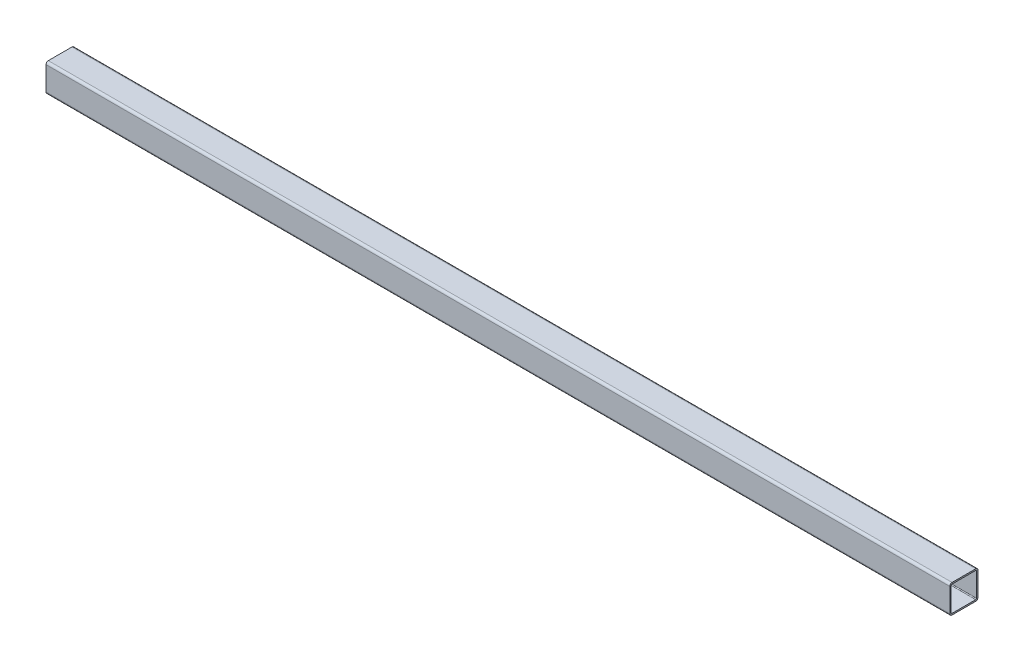
ISO-10303-21;
HEADER;
FILE_DESCRIPTION(('STEP AP214'),'2;1');
FILE_NAME('part.step','',(''),(''),'','','');
FILE_SCHEMA(('AUTOMOTIVE_DESIGN { 1 0 10303 214 1 1 1 1 }'));
ENDSEC;
DATA;
#1=APPLICATION_CONTEXT('core data for automotive mechanical design processes');
#2=APPLICATION_PROTOCOL_DEFINITION('international standard','automotive_design',2000,#1);
#3=PRODUCT_CONTEXT('',#1,'mechanical');
#4=PRODUCT('Part','Part','',(#3));
#5=PRODUCT_RELATED_PRODUCT_CATEGORY('part','',(#4));
#6=PRODUCT_DEFINITION_FORMATION('','',#4);
#7=PRODUCT_DEFINITION_CONTEXT('part definition',#1,'design');
#8=PRODUCT_DEFINITION('design','',#6,#7);
#9=PRODUCT_DEFINITION_SHAPE('','',#8);
#10=(LENGTH_UNIT() NAMED_UNIT(*) SI_UNIT(.MILLI.,.METRE.));
#11=(NAMED_UNIT(*) PLANE_ANGLE_UNIT() SI_UNIT($,.RADIAN.));
#12=(NAMED_UNIT(*) SI_UNIT($,.STERADIAN.) SOLID_ANGLE_UNIT());
#13=UNCERTAINTY_MEASURE_WITH_UNIT(LENGTH_MEASURE(1.E-05),#10,'distance_accuracy_value','');
#14=(GEOMETRIC_REPRESENTATION_CONTEXT(3) GLOBAL_UNCERTAINTY_ASSIGNED_CONTEXT((#13)) GLOBAL_UNIT_ASSIGNED_CONTEXT((#10,
#11,#12)) REPRESENTATION_CONTEXT('',''));
#15=CARTESIAN_POINT('',(0.,0.,0.));
#16=DIRECTION('',(0.,0.,1.));
#17=DIRECTION('',(1.,0.,0.));
#18=AXIS2_PLACEMENT_3D('',#15,#16,#17);
#19=CARTESIAN_POINT('',(609.6,7.90033438413667,24.0360225974819));
#20=DIRECTION('',(1.,0.,0.));
#21=DIRECTION('',(0.,0.,-1.));
#22=AXIS2_PLACEMENT_3D('',#19,#20,#21);
#23=PLANE('',#22);
#24=CARTESIAN_POINT('',(609.6,7.90033438413668,24.0360225974819));
#25=DIRECTION('',(1.,0.,0.));
#26=DIRECTION('',(0.,0.,-1.));
#27=AXIS2_PLACEMENT_3D('',#24,#25,#26);
#28=CIRCLE('',#27,1.55033438425608);
#29=CARTESIAN_POINT('',(609.6,7.90033438413667,25.5863569817379));
#30=VERTEX_POINT('',#29);
#31=CARTESIAN_POINT('',(609.6,6.3499999998806,24.0360225974819));
#32=VERTEX_POINT('',#31);
#33=EDGE_CURVE('E269',#30,#32,#28,.T.);
#34=ORIENTED_EDGE('',*,*,#33,.T.);
#35=DIRECTION('',(0.,0.,-1.));
#36=VECTOR('',#35,1.);
#37=CARTESIAN_POINT('',(609.6,6.3499999998806,24.0360225974819));
#38=LINE('',#37,#36);
#39=CARTESIAN_POINT('',(609.6,6.3499999998806,8.08669136599401));
#40=VERTEX_POINT('',#39);
#41=EDGE_CURVE('E494',#32,#40,#38,.T.);
#42=ORIENTED_EDGE('',*,*,#41,.T.);
#43=CARTESIAN_POINT('',(609.6,7.90033438413667,8.08669136599401));
#44=DIRECTION('',(1.,0.,0.));
#45=DIRECTION('',(0.,0.,-1.));
#46=AXIS2_PLACEMENT_3D('',#43,#44,#45);
#47=CIRCLE('',#46,1.55033438425607);
#48=CARTESIAN_POINT('',(609.6,7.90033438413667,6.53635698173793));
#49=VERTEX_POINT('',#48);
#50=EDGE_CURVE('E170',#40,#49,#47,.T.);
#51=ORIENTED_EDGE('',*,*,#50,.T.);
#52=DIRECTION('',(0.,1.,0.));
#53=VECTOR('',#52,1.);
#54=CARTESIAN_POINT('',(609.6,7.90033438413667,6.53635698173793));
#55=LINE('',#54,#53);
#56=CARTESIAN_POINT('',(609.6,23.8496656156245,6.53635698173793));
#57=VERTEX_POINT('',#56);
#58=EDGE_CURVE('E481',#49,#57,#55,.T.);
#59=ORIENTED_EDGE('',*,*,#58,.T.);
#60=CARTESIAN_POINT('',(609.6,23.8496656156245,8.08669136599401));
#61=DIRECTION('',(1.,0.,0.));
#62=DIRECTION('',(0.,0.,-1.));
#63=AXIS2_PLACEMENT_3D('',#60,#61,#62);
#64=CIRCLE('',#63,1.55033438425607);
#65=CARTESIAN_POINT('',(609.6,25.3999999998806,8.08669136599401));
#66=VERTEX_POINT('',#65);
#67=EDGE_CURVE('E490',#57,#66,#64,.T.);
#68=ORIENTED_EDGE('',*,*,#67,.T.);
#69=DIRECTION('',(0.,0.,1.));
#70=VECTOR('',#69,1.);
#71=CARTESIAN_POINT('',(609.6,25.3999999998806,8.08669136599401));
#72=LINE('',#71,#70);
#73=CARTESIAN_POINT('',(609.6,25.3999999998806,24.0360225974819));
#74=VERTEX_POINT('',#73);
#75=EDGE_CURVE('E285',#66,#74,#72,.T.);
#76=ORIENTED_EDGE('',*,*,#75,.T.);
#77=CARTESIAN_POINT('',(609.6,23.8496656156245,24.0360225974819));
#78=DIRECTION('',(1.,0.,0.));
#79=DIRECTION('',(0.,0.,-1.));
#80=AXIS2_PLACEMENT_3D('',#77,#78,#79);
#81=CIRCLE('',#80,1.55033438425608);
#82=CARTESIAN_POINT('',(609.6,23.8496656156245,25.5863569817379));
#83=VERTEX_POINT('',#82);
#84=EDGE_CURVE('E302',#74,#83,#81,.T.);
#85=ORIENTED_EDGE('',*,*,#84,.T.);
#86=DIRECTION('',(0.,-1.,0.));
#87=VECTOR('',#86,1.);
#88=CARTESIAN_POINT('',(609.6,23.8496656156245,25.5863569817379));
#89=LINE('',#88,#87);
#90=EDGE_CURVE('E266',#83,#30,#89,.T.);
#91=ORIENTED_EDGE('',*,*,#90,.T.);
#92=EDGE_LOOP('',(#34,#42,#51,#59,#68,#76,#85,#91));
#93=FACE_BOUND('',#92,.T.);
#94=DIRECTION('',(0.,1.,0.));
#95=VECTOR('',#94,1.);
#96=CARTESIAN_POINT('',(609.6,7.87399999987999,7.52695698173792));
#97=LINE('',#96,#95);
#98=CARTESIAN_POINT('',(609.6,7.87399999987999,7.52695698173792));
#99=VERTEX_POINT('',#98);
#100=CARTESIAN_POINT('',(609.6,23.8750732117556,7.52695698173792));
#101=VERTEX_POINT('',#100);
#102=EDGE_CURVE('E262',#99,#101,#97,.T.);
#103=ORIENTED_EDGE('',*,*,#102,.F.);
#104=CARTESIAN_POINT('',(609.6,7.87399919472792,8.06035698173732));
#105=DIRECTION('',(1.,0.,0.));
#106=DIRECTION('',(0.,0.,-1.));
#107=AXIS2_PLACEMENT_3D('',#104,#105,#106);
#108=CIRCLE('',#107,0.533400000000004);
#109=CARTESIAN_POINT('',(609.6,7.34059999988059,8.06128376986236));
#110=VERTEX_POINT('',#109);
#111=EDGE_CURVE('E109',#110,#99,#108,.T.);
#112=ORIENTED_EDGE('',*,*,#111,.F.);
#113=DIRECTION('',(0.,0.,-1.));
#114=VECTOR('',#113,1.);
#115=CARTESIAN_POINT('',(609.6,7.3405999998806,24.0623569817379));
#116=LINE('',#115,#114);
#117=CARTESIAN_POINT('',(609.6,7.3405999998806,24.0623569817379));
#118=VERTEX_POINT('',#117);
#119=EDGE_CURVE('E221',#118,#110,#116,.T.);
#120=ORIENTED_EDGE('',*,*,#119,.F.);
#121=CARTESIAN_POINT('',(609.6,7.87399999987999,24.0623577868906));
#122=DIRECTION('',(1.,0.,0.));
#123=DIRECTION('',(0.,0.,-1.));
#124=AXIS2_PLACEMENT_3D('',#121,#122,#123);
#125=CIRCLE('',#124,0.533400000000005);
#126=CARTESIAN_POINT('',(609.6,7.87492678800502,24.5957569817379));
#127=VERTEX_POINT('',#126);
#128=EDGE_CURVE('E252',#127,#118,#125,.T.);
#129=ORIENTED_EDGE('',*,*,#128,.F.);
#130=DIRECTION('',(0.,-1.,0.));
#131=VECTOR('',#130,1.);
#132=CARTESIAN_POINT('',(609.6,23.8759999998806,24.5957569817379));
#133=LINE('',#132,#131);
#134=CARTESIAN_POINT('',(609.6,23.8759999998806,24.5957569817379));
#135=VERTEX_POINT('',#134);
#136=EDGE_CURVE('E238',#135,#127,#133,.T.);
#137=ORIENTED_EDGE('',*,*,#136,.F.);
#138=CARTESIAN_POINT('',(609.6,23.8759999998806,24.0623569817379));
#139=DIRECTION('',(1.,0.,0.));
#140=DIRECTION('',(0.,0.,-1.));
#141=AXIS2_PLACEMENT_3D('',#138,#139,#140);
#142=CIRCLE('',#141,0.533400000000007);
#143=CARTESIAN_POINT('',(609.6,24.4093999998806,24.0623569817379));
#144=VERTEX_POINT('',#143);
#145=EDGE_CURVE('E247',#144,#135,#142,.T.);
#146=ORIENTED_EDGE('',*,*,#145,.F.);
#147=DIRECTION('',(0.,0.,1.));
#148=VECTOR('',#147,1.);
#149=CARTESIAN_POINT('',(609.6,24.4093999998806,8.06128376986236));
#150=LINE('',#149,#148);
#151=CARTESIAN_POINT('',(609.6,24.4093999998806,8.06128376986236));
#152=VERTEX_POINT('',#151);
#153=EDGE_CURVE('E255',#152,#144,#150,.T.);
#154=ORIENTED_EDGE('',*,*,#153,.F.);
#155=CARTESIAN_POINT('',(609.6,23.8760008064353,8.06035617518324));
#156=DIRECTION('',(1.,3.53726020742631E-13,-3.53726020743027E-13));
#157=DIRECTION('',(-3.53726020743027E-13,0.,-1.));
#158=AXIS2_PLACEMENT_3D('',#155,#156,#157);
#159=CIRCLE('',#158,0.533400000000002);
#160=EDGE_CURVE('E260',#101,#152,#159,.T.);
#161=ORIENTED_EDGE('',*,*,#160,.F.);
#162=EDGE_LOOP('',(#103,#112,#120,#129,#137,#146,#154,#161));
#163=FACE_BOUND('',#162,.T.);
#164=ADVANCED_FACE('F50',(#93,#163),#23,.T.);
#165=CARTESIAN_POINT('',(0.,7.90033438413667,24.0360225974819));
#166=DIRECTION('',(1.,0.,0.));
#167=DIRECTION('',(0.,0.,-1.));
#168=AXIS2_PLACEMENT_3D('',#165,#166,#167);
#169=PLANE('',#168);
#170=CARTESIAN_POINT('',(0.,7.90033438413668,24.0360225974819));
#171=DIRECTION('',(1.,0.,0.));
#172=DIRECTION('',(0.,0.,-1.));
#173=AXIS2_PLACEMENT_3D('',#170,#171,#172);
#174=CIRCLE('',#173,1.55033438425608);
#175=CARTESIAN_POINT('',(0.,7.90033438413667,25.5863569817379));
#176=VERTEX_POINT('',#175);
#177=CARTESIAN_POINT('',(0.,6.3499999998806,24.0360225974819));
#178=VERTEX_POINT('',#177);
#179=EDGE_CURVE('E163',#176,#178,#174,.T.);
#180=ORIENTED_EDGE('',*,*,#179,.F.);
#181=DIRECTION('',(0.,-1.,0.));
#182=VECTOR('',#181,1.);
#183=CARTESIAN_POINT('',(0.,23.8496656156245,25.5863569817379));
#184=LINE('',#183,#182);
#185=CARTESIAN_POINT('',(0.,23.8496656156245,25.5863569817379));
#186=VERTEX_POINT('',#185);
#187=EDGE_CURVE('E267',#186,#176,#184,.T.);
#188=ORIENTED_EDGE('',*,*,#187,.F.);
#189=CARTESIAN_POINT('',(0.,23.8496656156245,24.0360225974819));
#190=DIRECTION('',(1.,0.,0.));
#191=DIRECTION('',(0.,0.,-1.));
#192=AXIS2_PLACEMENT_3D('',#189,#190,#191);
#193=CIRCLE('',#192,1.55033438425608);
#194=CARTESIAN_POINT('',(0.,25.3999999998806,24.0360225974819));
#195=VERTEX_POINT('',#194);
#196=EDGE_CURVE('E270',#195,#186,#193,.T.);
#197=ORIENTED_EDGE('',*,*,#196,.F.);
#198=DIRECTION('',(0.,0.,1.));
#199=VECTOR('',#198,1.);
#200=CARTESIAN_POINT('',(0.,25.3999999998806,8.08669136599401));
#201=LINE('',#200,#199);
#202=CARTESIAN_POINT('',(0.,25.3999999998806,8.08669136599401));
#203=VERTEX_POINT('',#202);
#204=EDGE_CURVE('E272',#203,#195,#201,.T.);
#205=ORIENTED_EDGE('',*,*,#204,.F.);
#206=CARTESIAN_POINT('',(0.,23.8496656156245,8.08669136599401));
#207=DIRECTION('',(1.,0.,0.));
#208=DIRECTION('',(0.,0.,-1.));
#209=AXIS2_PLACEMENT_3D('',#206,#207,#208);
#210=CIRCLE('',#209,1.55033438425607);
#211=CARTESIAN_POINT('',(0.,23.8496656156245,6.53635698173793));
#212=VERTEX_POINT('',#211);
#213=EDGE_CURVE('E179',#212,#203,#210,.T.);
#214=ORIENTED_EDGE('',*,*,#213,.F.);
#215=DIRECTION('',(0.,1.,0.));
#216=VECTOR('',#215,1.);
#217=CARTESIAN_POINT('',(0.,7.90033438413667,6.53635698173793));
#218=LINE('',#217,#216);
#219=CARTESIAN_POINT('',(0.,7.90033438413667,6.53635698173793));
#220=VERTEX_POINT('',#219);
#221=EDGE_CURVE('E177',#220,#212,#218,.T.);
#222=ORIENTED_EDGE('',*,*,#221,.F.);
#223=CARTESIAN_POINT('',(0.,7.90033438413667,8.08669136599401));
#224=DIRECTION('',(1.,0.,0.));
#225=DIRECTION('',(0.,0.,-1.));
#226=AXIS2_PLACEMENT_3D('',#223,#224,#225);
#227=CIRCLE('',#226,1.55033438425607);
#228=CARTESIAN_POINT('',(0.,6.3499999998806,8.08669136599401));
#229=VERTEX_POINT('',#228);
#230=EDGE_CURVE('E162',#229,#220,#227,.T.);
#231=ORIENTED_EDGE('',*,*,#230,.F.);
#232=DIRECTION('',(0.,0.,-1.));
#233=VECTOR('',#232,1.);
#234=CARTESIAN_POINT('',(0.,6.3499999998806,24.0360225974819));
#235=LINE('',#234,#233);
#236=EDGE_CURVE('E152',#178,#229,#235,.T.);
#237=ORIENTED_EDGE('',*,*,#236,.F.);
#238=EDGE_LOOP('',(#180,#188,#197,#205,#214,#222,#231,#237));
#239=FACE_BOUND('',#238,.T.);
#240=CARTESIAN_POINT('',(0.,7.87399919472792,8.06035698173732));
#241=DIRECTION('',(1.,0.,0.));
#242=DIRECTION('',(0.,0.,-1.));
#243=AXIS2_PLACEMENT_3D('',#240,#241,#242);
#244=CIRCLE('',#243,0.533400000000001);
#245=CARTESIAN_POINT('',(0.,7.34059999988059,8.06128376986236));
#246=VERTEX_POINT('',#245);
#247=CARTESIAN_POINT('',(0.,7.87399999987999,7.52695698173792));
#248=VERTEX_POINT('',#247);
#249=EDGE_CURVE('E75',#246,#248,#244,.T.);
#250=ORIENTED_EDGE('',*,*,#249,.T.);
#251=DIRECTION('',(0.,1.,0.));
#252=VECTOR('',#251,1.);
#253=CARTESIAN_POINT('',(0.,7.87399999987999,7.52695698173792));
#254=LINE('',#253,#252);
#255=CARTESIAN_POINT('',(0.,23.8750732117556,7.52695698173792));
#256=VERTEX_POINT('',#255);
#257=EDGE_CURVE('E184',#248,#256,#254,.T.);
#258=ORIENTED_EDGE('',*,*,#257,.T.);
#259=CARTESIAN_POINT('',(0.,23.8760008064353,8.06035617518324));
#260=DIRECTION('',(1.,0.,0.));
#261=DIRECTION('',(0.,0.,-1.));
#262=AXIS2_PLACEMENT_3D('',#259,#260,#261);
#263=CIRCLE('',#262,0.533400000000002);
#264=CARTESIAN_POINT('',(0.,24.4093999998806,8.06128376986236));
#265=VERTEX_POINT('',#264);
#266=EDGE_CURVE('E187',#256,#265,#263,.T.);
#267=ORIENTED_EDGE('',*,*,#266,.T.);
#268=DIRECTION('',(0.,0.,1.));
#269=VECTOR('',#268,1.);
#270=CARTESIAN_POINT('',(0.,24.4093999998806,8.06128376986236));
#271=LINE('',#270,#269);
#272=CARTESIAN_POINT('',(0.,24.4093999998806,24.0623569817379));
#273=VERTEX_POINT('',#272);
#274=EDGE_CURVE('E190',#265,#273,#271,.T.);
#275=ORIENTED_EDGE('',*,*,#274,.T.);
#276=CARTESIAN_POINT('',(0.,23.8759999998806,24.0623569817379));
#277=DIRECTION('',(1.,0.,0.));
#278=DIRECTION('',(0.,0.,-1.));
#279=AXIS2_PLACEMENT_3D('',#276,#277,#278);
#280=CIRCLE('',#279,0.533400000000007);
#281=CARTESIAN_POINT('',(0.,23.8759999998806,24.5957569817379));
#282=VERTEX_POINT('',#281);
#283=EDGE_CURVE('E193',#273,#282,#280,.T.);
#284=ORIENTED_EDGE('',*,*,#283,.T.);
#285=DIRECTION('',(0.,-1.,0.));
#286=VECTOR('',#285,1.);
#287=CARTESIAN_POINT('',(0.,23.8759999998806,24.5957569817379));
#288=LINE('',#287,#286);
#289=CARTESIAN_POINT('',(0.,7.87492678800502,24.5957569817379));
#290=VERTEX_POINT('',#289);
#291=EDGE_CURVE('E196',#282,#290,#288,.T.);
#292=ORIENTED_EDGE('',*,*,#291,.T.);
#293=CARTESIAN_POINT('',(0.,7.87399999987999,24.0623577868906));
#294=DIRECTION('',(1.,0.,0.));
#295=DIRECTION('',(0.,0.,-1.));
#296=AXIS2_PLACEMENT_3D('',#293,#294,#295);
#297=CIRCLE('',#296,0.533400000000005);
#298=CARTESIAN_POINT('',(0.,7.34059999988059,24.0623569817379));
#299=VERTEX_POINT('',#298);
#300=EDGE_CURVE('E199',#290,#299,#297,.T.);
#301=ORIENTED_EDGE('',*,*,#300,.T.);
#302=DIRECTION('',(0.,0.,-1.));
#303=VECTOR('',#302,1.);
#304=CARTESIAN_POINT('',(0.,7.3405999998806,24.0623569817379));
#305=LINE('',#304,#303);
#306=EDGE_CURVE('E202',#299,#246,#305,.T.);
#307=ORIENTED_EDGE('',*,*,#306,.T.);
#308=EDGE_LOOP('',(#250,#258,#267,#275,#284,#292,#301,#307));
#309=FACE_BOUND('',#308,.T.);
#310=ADVANCED_FACE('F174',(#239,#309),#169,.F.);
#311=CARTESIAN_POINT('',(609.6,7.90033438413667,24.0360225974819));
#312=DIRECTION('',(-1.,0.,0.));
#313=DIRECTION('',(0.,-1.,0.));
#314=AXIS2_PLACEMENT_3D('',#311,#312,#313);
#315=CYLINDRICAL_SURFACE('',#314,1.55033438425608);
#316=ORIENTED_EDGE('',*,*,#179,.T.);
#317=DIRECTION('',(-1.,0.,0.));
#318=VECTOR('',#317,1.);
#319=CARTESIAN_POINT('',(609.6,6.3499999998806,24.0360225974819));
#320=LINE('',#319,#318);
#321=EDGE_CURVE('E12',#32,#178,#320,.T.);
#322=ORIENTED_EDGE('',*,*,#321,.F.);
#323=ORIENTED_EDGE('',*,*,#33,.F.);
#324=DIRECTION('',(-1.,0.,0.));
#325=VECTOR('',#324,1.);
#326=CARTESIAN_POINT('',(609.6,7.90033438413667,25.5863569817379));
#327=LINE('',#326,#325);
#328=EDGE_CURVE('E218',#30,#176,#327,.T.);
#329=ORIENTED_EDGE('',*,*,#328,.T.);
#330=EDGE_LOOP('',(#316,#322,#323,#329));
#331=FACE_BOUND('',#330,.T.);
#332=ADVANCED_FACE('F332',(#331),#315,.T.);
#333=CARTESIAN_POINT('',(609.6,6.3499999998806,24.0360225974819));
#334=DIRECTION('',(0.,1.,0.));
#335=DIRECTION('',(0.,0.,1.));
#336=AXIS2_PLACEMENT_3D('',#333,#334,#335);
#337=PLANE('',#336);
#338=ORIENTED_EDGE('',*,*,#236,.T.);
#339=DIRECTION('',(-1.,0.,0.));
#340=VECTOR('',#339,1.);
#341=CARTESIAN_POINT('',(609.6,6.3499999998806,8.08669136599401));
#342=LINE('',#341,#340);
#343=EDGE_CURVE('E59',#40,#229,#342,.T.);
#344=ORIENTED_EDGE('',*,*,#343,.F.);
#345=ORIENTED_EDGE('',*,*,#41,.F.);
#346=ORIENTED_EDGE('',*,*,#321,.T.);
#347=EDGE_LOOP('',(#338,#344,#345,#346));
#348=FACE_BOUND('',#347,.T.);
#349=ADVANCED_FACE('F156',(#348),#337,.F.);
#350=CARTESIAN_POINT('',(609.6,7.90033438413667,8.08669136599401));
#351=DIRECTION('',(-1.,0.,0.));
#352=DIRECTION('',(0.,-1.,0.));
#353=AXIS2_PLACEMENT_3D('',#350,#351,#352);
#354=CYLINDRICAL_SURFACE('',#353,1.55033438425608);
#355=ORIENTED_EDGE('',*,*,#230,.T.);
#356=DIRECTION('',(-1.,0.,0.));
#357=VECTOR('',#356,1.);
#358=CARTESIAN_POINT('',(609.6,7.90033438413667,6.53635698173793));
#359=LINE('',#358,#357);
#360=EDGE_CURVE('E171',#49,#220,#359,.T.);
#361=ORIENTED_EDGE('',*,*,#360,.F.);
#362=ORIENTED_EDGE('',*,*,#50,.F.);
#363=ORIENTED_EDGE('',*,*,#343,.T.);
#364=EDGE_LOOP('',(#355,#361,#362,#363));
#365=FACE_BOUND('',#364,.T.);
#366=ADVANCED_FACE('F166',(#365),#354,.T.);
#367=CARTESIAN_POINT('',(609.6,7.90033438413667,6.53635698173793));
#368=DIRECTION('',(0.,0.,1.));
#369=DIRECTION('',(0.,-1.,0.));
#370=AXIS2_PLACEMENT_3D('',#367,#368,#369);
#371=PLANE('',#370);
#372=ORIENTED_EDGE('',*,*,#221,.T.);
#373=DIRECTION('',(-1.,0.,0.));
#374=VECTOR('',#373,1.);
#375=CARTESIAN_POINT('',(609.6,23.8496656156245,6.53635698173793));
#376=LINE('',#375,#374);
#377=EDGE_CURVE('E206',#57,#212,#376,.T.);
#378=ORIENTED_EDGE('',*,*,#377,.F.);
#379=ORIENTED_EDGE('',*,*,#58,.F.);
#380=ORIENTED_EDGE('',*,*,#360,.T.);
#381=EDGE_LOOP('',(#372,#378,#379,#380));
#382=FACE_BOUND('',#381,.T.);
#383=ADVANCED_FACE('F342',(#382),#371,.F.);
#384=CARTESIAN_POINT('',(609.6,23.8496656156245,8.08669136599401));
#385=DIRECTION('',(-1.,0.,0.));
#386=DIRECTION('',(0.,-1.,0.));
#387=AXIS2_PLACEMENT_3D('',#384,#385,#386);
#388=CYLINDRICAL_SURFACE('',#387,1.55033438425608);
#389=ORIENTED_EDGE('',*,*,#213,.T.);
#390=DIRECTION('',(-1.,0.,0.));
#391=VECTOR('',#390,1.);
#392=CARTESIAN_POINT('',(609.6,25.3999999998806,8.08669136599401));
#393=LINE('',#392,#391);
#394=EDGE_CURVE('E209',#66,#203,#393,.T.);
#395=ORIENTED_EDGE('',*,*,#394,.F.);
#396=ORIENTED_EDGE('',*,*,#67,.F.);
#397=ORIENTED_EDGE('',*,*,#377,.T.);
#398=EDGE_LOOP('',(#389,#395,#396,#397));
#399=FACE_BOUND('',#398,.T.);
#400=ADVANCED_FACE('F275',(#399),#388,.T.);
#401=CARTESIAN_POINT('',(609.6,25.3999999998806,8.08669136599401));
#402=DIRECTION('',(0.,-1.,0.));
#403=DIRECTION('',(0.,0.,-1.));
#404=AXIS2_PLACEMENT_3D('',#401,#402,#403);
#405=PLANE('',#404);
#406=ORIENTED_EDGE('',*,*,#204,.T.);
#407=DIRECTION('',(-1.,0.,0.));
#408=VECTOR('',#407,1.);
#409=CARTESIAN_POINT('',(609.6,25.3999999998806,24.0360225974819));
#410=LINE('',#409,#408);
#411=EDGE_CURVE('E212',#74,#195,#410,.T.);
#412=ORIENTED_EDGE('',*,*,#411,.F.);
#413=ORIENTED_EDGE('',*,*,#75,.F.);
#414=ORIENTED_EDGE('',*,*,#394,.T.);
#415=EDGE_LOOP('',(#406,#412,#413,#414));
#416=FACE_BOUND('',#415,.T.);
#417=ADVANCED_FACE('F282',(#416),#405,.F.);
#418=CARTESIAN_POINT('',(609.6,23.8496656156245,24.0360225974819));
#419=DIRECTION('',(-1.,0.,0.));
#420=DIRECTION('',(0.,-1.,0.));
#421=AXIS2_PLACEMENT_3D('',#418,#419,#420);
#422=CYLINDRICAL_SURFACE('',#421,1.55033438425608);
#423=ORIENTED_EDGE('',*,*,#196,.T.);
#424=DIRECTION('',(-1.,0.,0.));
#425=VECTOR('',#424,1.);
#426=CARTESIAN_POINT('',(609.6,23.8496656156245,25.5863569817379));
#427=LINE('',#426,#425);
#428=EDGE_CURVE('E215',#83,#186,#427,.T.);
#429=ORIENTED_EDGE('',*,*,#428,.F.);
#430=ORIENTED_EDGE('',*,*,#84,.F.);
#431=ORIENTED_EDGE('',*,*,#411,.T.);
#432=EDGE_LOOP('',(#423,#429,#430,#431));
#433=FACE_BOUND('',#432,.T.);
#434=ADVANCED_FACE('F290',(#433),#422,.T.);
#435=CARTESIAN_POINT('',(609.6,23.8496656156245,25.5863569817379));
#436=DIRECTION('',(0.,0.,-1.));
#437=DIRECTION('',(0.,1.,0.));
#438=AXIS2_PLACEMENT_3D('',#435,#436,#437);
#439=PLANE('',#438);
#440=ORIENTED_EDGE('',*,*,#187,.T.);
#441=ORIENTED_EDGE('',*,*,#328,.F.);
#442=ORIENTED_EDGE('',*,*,#90,.F.);
#443=ORIENTED_EDGE('',*,*,#428,.T.);
#444=EDGE_LOOP('',(#440,#441,#442,#443));
#445=FACE_BOUND('',#444,.T.);
#446=ADVANCED_FACE('F294',(#445),#439,.F.);
#447=CARTESIAN_POINT('',(609.6,7.87399919472792,8.06035698173732));
#448=DIRECTION('',(-1.,-1.04070399758638E-13,0.));
#449=DIRECTION('',(1.04070399758638E-13,-1.,0.));
#450=AXIS2_PLACEMENT_3D('',#447,#448,#449);
#451=CYLINDRICAL_SURFACE('',#450,0.533400000000003);
#452=ORIENTED_EDGE('',*,*,#249,.F.);
#453=DIRECTION('',(-1.,0.,0.));
#454=VECTOR('',#453,1.);
#455=CARTESIAN_POINT('',(609.6,7.34059999988059,8.06128376986236));
#456=LINE('',#455,#454);
#457=EDGE_CURVE('E219',#110,#246,#456,.T.);
#458=ORIENTED_EDGE('',*,*,#457,.F.);
#459=ORIENTED_EDGE('',*,*,#111,.T.);
#460=DIRECTION('',(-1.,0.,0.));
#461=VECTOR('',#460,1.);
#462=CARTESIAN_POINT('',(609.6,7.87399999987999,7.52695698173792));
#463=LINE('',#462,#461);
#464=EDGE_CURVE('E222',#99,#248,#463,.T.);
#465=ORIENTED_EDGE('',*,*,#464,.T.);
#466=EDGE_LOOP('',(#452,#458,#459,#465));
#467=FACE_BOUND('',#466,.T.);
#468=ADVANCED_FACE('F308',(#467),#451,.F.);
#469=CARTESIAN_POINT('',(609.6,7.87399999987999,7.52695698173792));
#470=DIRECTION('',(0.,0.,1.));
#471=DIRECTION('',(0.,-1.,0.));
#472=AXIS2_PLACEMENT_3D('',#469,#470,#471);
#473=PLANE('',#472);
#474=ORIENTED_EDGE('',*,*,#257,.F.);
#475=ORIENTED_EDGE('',*,*,#464,.F.);
#476=ORIENTED_EDGE('',*,*,#102,.T.);
#477=DIRECTION('',(-1.,0.,0.));
#478=VECTOR('',#477,1.);
#479=CARTESIAN_POINT('',(609.6,23.8750732117556,7.52695698173792));
#480=LINE('',#479,#478);
#481=EDGE_CURVE('E224',#101,#256,#480,.T.);
#482=ORIENTED_EDGE('',*,*,#481,.T.);
#483=EDGE_LOOP('',(#474,#475,#476,#482));
#484=FACE_BOUND('',#483,.T.);
#485=ADVANCED_FACE('F312',(#484),#473,.T.);
#486=CARTESIAN_POINT('',(609.6,23.8760008064353,8.06035617518324));
#487=DIRECTION('',(-1.,-1.04070399758638E-13,0.));
#488=DIRECTION('',(1.04070399758638E-13,-1.,0.));
#489=AXIS2_PLACEMENT_3D('',#486,#487,#488);
#490=CYLINDRICAL_SURFACE('',#489,0.533400000000003);
#491=ORIENTED_EDGE('',*,*,#266,.F.);
#492=ORIENTED_EDGE('',*,*,#481,.F.);
#493=ORIENTED_EDGE('',*,*,#160,.T.);
#494=DIRECTION('',(-1.,0.,0.));
#495=VECTOR('',#494,1.);
#496=CARTESIAN_POINT('',(609.6,24.4093999998806,8.06128376986236));
#497=LINE('',#496,#495);
#498=EDGE_CURVE('E226',#152,#265,#497,.T.);
#499=ORIENTED_EDGE('',*,*,#498,.T.);
#500=EDGE_LOOP('',(#491,#492,#493,#499));
#501=FACE_BOUND('',#500,.T.);
#502=ADVANCED_FACE('F315',(#501),#490,.F.);
#503=CARTESIAN_POINT('',(609.6,24.4093999998806,8.06128376986236));
#504=DIRECTION('',(0.,-1.,0.));
#505=DIRECTION('',(0.,0.,-1.));
#506=AXIS2_PLACEMENT_3D('',#503,#504,#505);
#507=PLANE('',#506);
#508=ORIENTED_EDGE('',*,*,#274,.F.);
#509=ORIENTED_EDGE('',*,*,#498,.F.);
#510=ORIENTED_EDGE('',*,*,#153,.T.);
#511=DIRECTION('',(-1.,0.,0.));
#512=VECTOR('',#511,1.);
#513=CARTESIAN_POINT('',(609.6,24.4093999998806,24.0623569817379));
#514=LINE('',#513,#512);
#515=EDGE_CURVE('E228',#144,#273,#514,.T.);
#516=ORIENTED_EDGE('',*,*,#515,.T.);
#517=EDGE_LOOP('',(#508,#509,#510,#516));
#518=FACE_BOUND('',#517,.T.);
#519=ADVANCED_FACE('F318',(#518),#507,.T.);
#520=CARTESIAN_POINT('',(609.6,23.8759999998806,24.0623569817379));
#521=DIRECTION('',(-1.,-1.04070399758638E-13,0.));
#522=DIRECTION('',(1.04070399758638E-13,-1.,0.));
#523=AXIS2_PLACEMENT_3D('',#520,#521,#522);
#524=CYLINDRICAL_SURFACE('',#523,0.533400000000003);
#525=ORIENTED_EDGE('',*,*,#283,.F.);
#526=ORIENTED_EDGE('',*,*,#515,.F.);
#527=ORIENTED_EDGE('',*,*,#145,.T.);
#528=DIRECTION('',(-1.,0.,0.));
#529=VECTOR('',#528,1.);
#530=CARTESIAN_POINT('',(609.6,23.8759999998806,24.5957569817379));
#531=LINE('',#530,#529);
#532=EDGE_CURVE('E230',#135,#282,#531,.T.);
#533=ORIENTED_EDGE('',*,*,#532,.T.);
#534=EDGE_LOOP('',(#525,#526,#527,#533));
#535=FACE_BOUND('',#534,.T.);
#536=ADVANCED_FACE('F245',(#535),#524,.F.);
#537=CARTESIAN_POINT('',(609.6,23.8759999998806,24.5957569817379));
#538=DIRECTION('',(0.,0.,-1.));
#539=DIRECTION('',(-1.,0.,0.));
#540=AXIS2_PLACEMENT_3D('',#537,#538,#539);
#541=PLANE('',#540);
#542=ORIENTED_EDGE('',*,*,#291,.F.);
#543=ORIENTED_EDGE('',*,*,#532,.F.);
#544=ORIENTED_EDGE('',*,*,#136,.T.);
#545=DIRECTION('',(-1.,0.,0.));
#546=VECTOR('',#545,1.);
#547=CARTESIAN_POINT('',(609.6,7.87492678800502,24.5957569817379));
#548=LINE('',#547,#546);
#549=EDGE_CURVE('E231',#127,#290,#548,.T.);
#550=ORIENTED_EDGE('',*,*,#549,.T.);
#551=EDGE_LOOP('',(#542,#543,#544,#550));
#552=FACE_BOUND('',#551,.T.);
#553=ADVANCED_FACE('F235',(#552),#541,.T.);
#554=CARTESIAN_POINT('',(609.6,7.87399999987999,24.0623577868906));
#555=DIRECTION('',(-1.,-1.04070399758638E-13,0.));
#556=DIRECTION('',(1.04070399758638E-13,-1.,0.));
#557=AXIS2_PLACEMENT_3D('',#554,#555,#556);
#558=CYLINDRICAL_SURFACE('',#557,0.533400000000005);
#559=ORIENTED_EDGE('',*,*,#300,.F.);
#560=ORIENTED_EDGE('',*,*,#549,.F.);
#561=ORIENTED_EDGE('',*,*,#128,.T.);
#562=DIRECTION('',(-1.,0.,0.));
#563=VECTOR('',#562,1.);
#564=CARTESIAN_POINT('',(609.6,7.34059999988059,24.0623569817379));
#565=LINE('',#564,#563);
#566=EDGE_CURVE('E54',#118,#299,#565,.T.);
#567=ORIENTED_EDGE('',*,*,#566,.T.);
#568=EDGE_LOOP('',(#559,#560,#561,#567));
#569=FACE_BOUND('',#568,.T.);
#570=ADVANCED_FACE('F240',(#569),#558,.F.);
#571=CARTESIAN_POINT('',(609.6,7.3405999998806,24.0623569817379));
#572=DIRECTION('',(0.,1.,0.));
#573=DIRECTION('',(0.,0.,1.));
#574=AXIS2_PLACEMENT_3D('',#571,#572,#573);
#575=PLANE('',#574);
#576=ORIENTED_EDGE('',*,*,#306,.F.);
#577=ORIENTED_EDGE('',*,*,#566,.F.);
#578=ORIENTED_EDGE('',*,*,#119,.T.);
#579=ORIENTED_EDGE('',*,*,#457,.T.);
#580=EDGE_LOOP('',(#576,#577,#578,#579));
#581=FACE_BOUND('',#580,.T.);
#582=ADVANCED_FACE('F52',(#581),#575,.T.);
#583=CLOSED_SHELL('',(#164,#310,#332,#349,#366,#383,#400,#417,#434,#446,#468,#485,#502,#519,
#536,#553,#570,#582));
#584=MANIFOLD_SOLID_BREP('B2',#583);
#585=ADVANCED_BREP_SHAPE_REPRESENTATION('',(#18,#584),#14);
#586=SHAPE_DEFINITION_REPRESENTATION(#9,#585);
ENDSEC;
END-ISO-10303-21;
